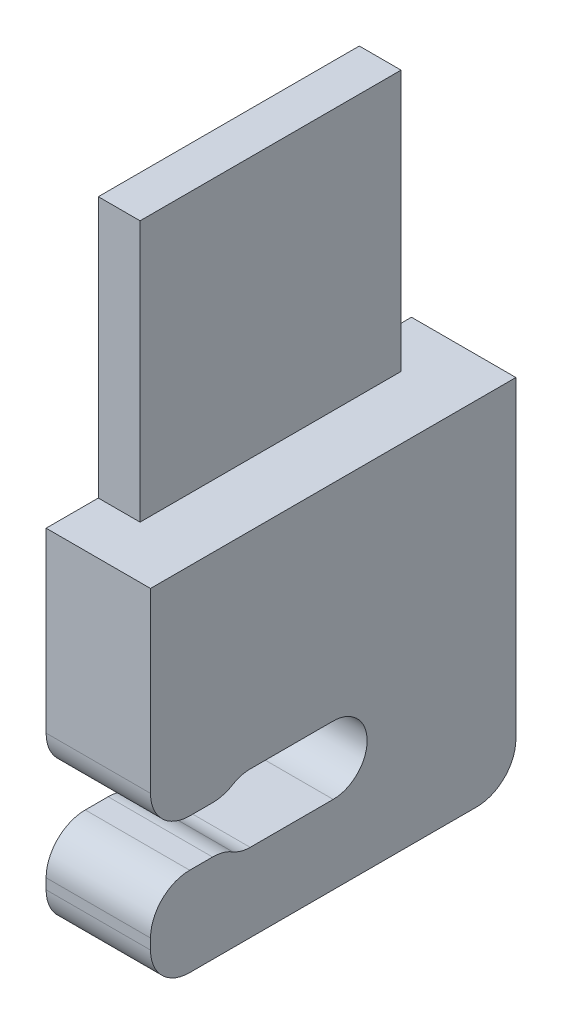
ISO-10303-21;
HEADER;
FILE_DESCRIPTION(('STEP AP214'),'2;1');
FILE_NAME('part.step','',(''),(''),'','','');
FILE_SCHEMA(('AUTOMOTIVE_DESIGN { 1 0 10303 214 1 1 1 1 }'));
ENDSEC;
DATA;
#1=APPLICATION_CONTEXT('core data for automotive mechanical design processes');
#2=APPLICATION_PROTOCOL_DEFINITION('international standard','automotive_design',2000,#1);
#3=PRODUCT_CONTEXT('',#1,'mechanical');
#4=PRODUCT('Part','Part','',(#3));
#5=PRODUCT_RELATED_PRODUCT_CATEGORY('part','',(#4));
#6=PRODUCT_DEFINITION_FORMATION('','',#4);
#7=PRODUCT_DEFINITION_CONTEXT('part definition',#1,'design');
#8=PRODUCT_DEFINITION('design','',#6,#7);
#9=PRODUCT_DEFINITION_SHAPE('','',#8);
#10=(LENGTH_UNIT() NAMED_UNIT(*) SI_UNIT(.MILLI.,.METRE.));
#11=(NAMED_UNIT(*) PLANE_ANGLE_UNIT() SI_UNIT($,.RADIAN.));
#12=(NAMED_UNIT(*) SI_UNIT($,.STERADIAN.) SOLID_ANGLE_UNIT());
#13=UNCERTAINTY_MEASURE_WITH_UNIT(LENGTH_MEASURE(1.E-05),#10,'distance_accuracy_value','');
#14=(GEOMETRIC_REPRESENTATION_CONTEXT(3) GLOBAL_UNCERTAINTY_ASSIGNED_CONTEXT((#13)) GLOBAL_UNIT_ASSIGNED_CONTEXT((#10,
#11,#12)) REPRESENTATION_CONTEXT('',''));
#15=CARTESIAN_POINT('',(0.,0.,0.));
#16=DIRECTION('',(0.,0.,1.));
#17=DIRECTION('',(1.,0.,0.));
#18=AXIS2_PLACEMENT_3D('',#15,#16,#17);
#19=CARTESIAN_POINT('',(1.6,0.,-10.));
#20=DIRECTION('',(0.,0.,1.));
#21=DIRECTION('',(0.,-1.,0.));
#22=AXIS2_PLACEMENT_3D('',#19,#20,#21);
#23=PLANE('',#22);
#24=DIRECTION('',(1.,0.,0.));
#25=VECTOR('',#24,1.);
#26=CARTESIAN_POINT('',(4.,-10.,-10.));
#27=LINE('',#26,#25);
#28=CARTESIAN_POINT('',(0.,-10.,-10.));
#29=VERTEX_POINT('',#28);
#30=CARTESIAN_POINT('',(1.6,-10.,-10.));
#31=VERTEX_POINT('',#30);
#32=EDGE_CURVE('E279',#29,#31,#27,.T.);
#33=ORIENTED_EDGE('',*,*,#32,.F.);
#34=DIRECTION('',(0.,1.,0.));
#35=VECTOR('',#34,1.);
#36=CARTESIAN_POINT('',(0.,0.,-10.));
#37=LINE('',#36,#35);
#38=CARTESIAN_POINT('',(0.,0.,-10.));
#39=VERTEX_POINT('',#38);
#40=EDGE_CURVE('E337',#29,#39,#37,.T.);
#41=ORIENTED_EDGE('',*,*,#40,.T.);
#42=DIRECTION('',(-1.,0.,0.));
#43=VECTOR('',#42,1.);
#44=CARTESIAN_POINT('',(1.6,0.,-10.));
#45=LINE('',#44,#43);
#46=CARTESIAN_POINT('',(1.6,0.,-10.));
#47=VERTEX_POINT('',#46);
#48=EDGE_CURVE('E310',#47,#39,#45,.T.);
#49=ORIENTED_EDGE('',*,*,#48,.F.);
#50=DIRECTION('',(0.,1.,0.));
#51=VECTOR('',#50,1.);
#52=CARTESIAN_POINT('',(1.6,0.,-10.));
#53=LINE('',#52,#51);
#54=EDGE_CURVE('E328',#31,#47,#53,.T.);
#55=ORIENTED_EDGE('',*,*,#54,.F.);
#56=EDGE_LOOP('',(#33,#41,#49,#55));
#57=FACE_BOUND('',#56,.T.);
#58=ADVANCED_FACE('F41',(#57),#23,.F.);
#59=CARTESIAN_POINT('',(1.6,0.,0.));
#60=DIRECTION('',(0.,0.,-1.));
#61=DIRECTION('',(-1.,0.,0.));
#62=AXIS2_PLACEMENT_3D('',#59,#60,#61);
#63=PLANE('',#62);
#64=DIRECTION('',(-1.,0.,0.));
#65=VECTOR('',#64,1.);
#66=CARTESIAN_POINT('',(4.,-10.,0.));
#67=LINE('',#66,#65);
#68=CARTESIAN_POINT('',(1.6,-10.,0.));
#69=VERTEX_POINT('',#68);
#70=CARTESIAN_POINT('',(0.,-10.,0.));
#71=VERTEX_POINT('',#70);
#72=EDGE_CURVE('E305',#69,#71,#67,.T.);
#73=ORIENTED_EDGE('',*,*,#72,.F.);
#74=DIRECTION('',(0.,-1.,0.));
#75=VECTOR('',#74,1.);
#76=CARTESIAN_POINT('',(1.6,0.,0.));
#77=LINE('',#76,#75);
#78=CARTESIAN_POINT('',(1.6,0.,0.));
#79=VERTEX_POINT('',#78);
#80=EDGE_CURVE('E319',#79,#69,#77,.T.);
#81=ORIENTED_EDGE('',*,*,#80,.F.);
#82=DIRECTION('',(-1.,0.,0.));
#83=VECTOR('',#82,1.);
#84=CARTESIAN_POINT('',(1.6,0.,0.));
#85=LINE('',#84,#83);
#86=CARTESIAN_POINT('',(0.,0.,0.));
#87=VERTEX_POINT('',#86);
#88=EDGE_CURVE('E334',#79,#87,#85,.T.);
#89=ORIENTED_EDGE('',*,*,#88,.T.);
#90=DIRECTION('',(0.,-1.,0.));
#91=VECTOR('',#90,1.);
#92=CARTESIAN_POINT('',(0.,0.,0.));
#93=LINE('',#92,#91);
#94=EDGE_CURVE('E318',#87,#71,#93,.T.);
#95=ORIENTED_EDGE('',*,*,#94,.T.);
#96=EDGE_LOOP('',(#73,#81,#89,#95));
#97=FACE_BOUND('',#96,.T.);
#98=ADVANCED_FACE('F425',(#97),#63,.F.);
#99=CARTESIAN_POINT('',(1.6,0.,0.));
#100=DIRECTION('',(0.,-1.,0.));
#101=DIRECTION('',(0.,0.,-1.));
#102=AXIS2_PLACEMENT_3D('',#99,#100,#101);
#103=PLANE('',#102);
#104=DIRECTION('',(0.,0.,1.));
#105=VECTOR('',#104,1.);
#106=CARTESIAN_POINT('',(0.,0.,0.));
#107=LINE('',#106,#105);
#108=EDGE_CURVE('E324',#39,#87,#107,.T.);
#109=ORIENTED_EDGE('',*,*,#108,.T.);
#110=ORIENTED_EDGE('',*,*,#88,.F.);
#111=DIRECTION('',(0.,0.,1.));
#112=VECTOR('',#111,1.);
#113=CARTESIAN_POINT('',(1.6,0.,0.));
#114=LINE('',#113,#112);
#115=EDGE_CURVE('E331',#47,#79,#114,.T.);
#116=ORIENTED_EDGE('',*,*,#115,.F.);
#117=ORIENTED_EDGE('',*,*,#48,.T.);
#118=EDGE_LOOP('',(#109,#110,#116,#117));
#119=FACE_BOUND('',#118,.T.);
#120=ADVANCED_FACE('F429',(#119),#103,.F.);
#121=CARTESIAN_POINT('',(1.6,0.,0.));
#122=DIRECTION('',(1.,0.,0.));
#123=DIRECTION('',(0.,0.,-1.));
#124=AXIS2_PLACEMENT_3D('',#121,#122,#123);
#125=PLANE('',#124);
#126=ORIENTED_EDGE('',*,*,#80,.T.);
#127=DIRECTION('',(0.,0.,-1.));
#128=VECTOR('',#127,1.);
#129=CARTESIAN_POINT('',(1.6,-10.,0.));
#130=LINE('',#129,#128);
#131=EDGE_CURVE('E323',#69,#31,#130,.T.);
#132=ORIENTED_EDGE('',*,*,#131,.T.);
#133=ORIENTED_EDGE('',*,*,#54,.T.);
#134=ORIENTED_EDGE('',*,*,#115,.T.);
#135=EDGE_LOOP('',(#126,#132,#133,#134));
#136=FACE_BOUND('',#135,.T.);
#137=ADVANCED_FACE('F438',(#136),#125,.T.);
#138=CARTESIAN_POINT('',(0.,0.,0.));
#139=DIRECTION('',(1.,0.,0.));
#140=DIRECTION('',(0.,0.,-1.));
#141=AXIS2_PLACEMENT_3D('',#138,#139,#140);
#142=PLANE('',#141);
#143=DIRECTION('',(0.,1.,0.));
#144=VECTOR('',#143,1.);
#145=CARTESIAN_POINT('',(0.,0.,2.));
#146=LINE('',#145,#144);
#147=CARTESIAN_POINT('',(0.,-22.,2.));
#148=VERTEX_POINT('',#147);
#149=CARTESIAN_POINT('',(0.,-21.6,2.));
#150=VERTEX_POINT('',#149);
#151=EDGE_CURVE('E717',#148,#150,#146,.T.);
#152=ORIENTED_EDGE('',*,*,#151,.T.);
#153=CARTESIAN_POINT('',(0.,-21.6,0.499999999999999));
#154=DIRECTION('',(1.,0.,0.));
#155=DIRECTION('',(0.,0.,-1.));
#156=AXIS2_PLACEMENT_3D('',#153,#154,#155);
#157=CIRCLE('',#156,1.5);
#158=CARTESIAN_POINT('',(0.,-20.1,0.499999999999999));
#159=VERTEX_POINT('',#158);
#160=EDGE_CURVE('E376',#150,#159,#157,.F.);
#161=ORIENTED_EDGE('',*,*,#160,.T.);
#162=DIRECTION('',(0.,0.,-1.));
#163=VECTOR('',#162,1.);
#164=CARTESIAN_POINT('',(0.,-20.1,0.));
#165=LINE('',#164,#163);
#166=CARTESIAN_POINT('',(0.,-20.1,-0.376528683431878));
#167=VERTEX_POINT('',#166);
#168=EDGE_CURVE('E729',#159,#167,#165,.T.);
#169=ORIENTED_EDGE('',*,*,#168,.T.);
#170=CARTESIAN_POINT('',(0.,-21.6,-0.376528683431878));
#171=DIRECTION('',(1.,0.,0.));
#172=DIRECTION('',(0.,0.,-1.));
#173=AXIS2_PLACEMENT_3D('',#170,#171,#172);
#174=CIRCLE('',#173,1.5);
#175=CARTESIAN_POINT('',(0.,-20.3142857142857,-1.14914681388844));
#176=VERTEX_POINT('',#175);
#177=EDGE_CURVE('E373',#167,#176,#174,.F.);
#178=ORIENTED_EDGE('',*,*,#177,.T.);
#179=CARTESIAN_POINT('',(0.,-19.2,-1.81874919361747));
#180=DIRECTION('',(1.,0.,0.));
#181=DIRECTION('',(0.,0.,-1.));
#182=AXIS2_PLACEMENT_3D('',#179,#180,#181);
#183=CIRCLE('',#182,1.3);
#184=CARTESIAN_POINT('',(0.,-20.5,-1.81874919361747));
#185=VERTEX_POINT('',#184);
#186=EDGE_CURVE('E256',#185,#176,#183,.F.);
#187=ORIENTED_EDGE('',*,*,#186,.F.);
#188=DIRECTION('',(0.,0.,-1.));
#189=VECTOR('',#188,1.);
#190=CARTESIAN_POINT('',(0.,-20.5,0.));
#191=LINE('',#190,#189);
#192=CARTESIAN_POINT('',(0.,-20.5,-5.));
#193=VERTEX_POINT('',#192);
#194=EDGE_CURVE('E276',#185,#193,#191,.T.);
#195=ORIENTED_EDGE('',*,*,#194,.T.);
#196=CARTESIAN_POINT('',(0.,-19.2,-5.));
#197=DIRECTION('',(1.,0.,0.));
#198=DIRECTION('',(0.,0.,-1.));
#199=AXIS2_PLACEMENT_3D('',#196,#197,#198);
#200=CIRCLE('',#199,1.3);
#201=CARTESIAN_POINT('',(0.,-17.9,-5.));
#202=VERTEX_POINT('',#201);
#203=EDGE_CURVE('E199',#202,#193,#200,.F.);
#204=ORIENTED_EDGE('',*,*,#203,.F.);
#205=DIRECTION('',(0.,0.,-1.));
#206=VECTOR('',#205,1.);
#207=CARTESIAN_POINT('',(0.,-17.9,0.));
#208=LINE('',#207,#206);
#209=CARTESIAN_POINT('',(0.,-17.9,-1.81874919361747));
#210=VERTEX_POINT('',#209);
#211=EDGE_CURVE('E400',#210,#202,#208,.T.);
#212=ORIENTED_EDGE('',*,*,#211,.F.);
#213=CARTESIAN_POINT('',(0.,-19.2,-1.81874919361747));
#214=DIRECTION('',(1.,0.,0.));
#215=DIRECTION('',(0.,0.,-1.));
#216=AXIS2_PLACEMENT_3D('',#213,#214,#215);
#217=CIRCLE('',#216,1.3);
#218=CARTESIAN_POINT('',(0.,-18.0857142857143,-1.14914681388844));
#219=VERTEX_POINT('',#218);
#220=EDGE_CURVE('E394',#219,#210,#217,.F.);
#221=ORIENTED_EDGE('',*,*,#220,.F.);
#222=CARTESIAN_POINT('',(0.,-16.8,-0.376528683431878));
#223=DIRECTION('',(1.,0.,0.));
#224=DIRECTION('',(0.,0.,-1.));
#225=AXIS2_PLACEMENT_3D('',#222,#223,#224);
#226=CIRCLE('',#225,1.5);
#227=CARTESIAN_POINT('',(0.,-18.3,-0.376528683431878));
#228=VERTEX_POINT('',#227);
#229=EDGE_CURVE('E63',#219,#228,#226,.F.);
#230=ORIENTED_EDGE('',*,*,#229,.T.);
#231=DIRECTION('',(0.,0.,-1.));
#232=VECTOR('',#231,1.);
#233=CARTESIAN_POINT('',(0.,-18.3,0.));
#234=LINE('',#233,#232);
#235=CARTESIAN_POINT('',(0.,-18.3,0.5));
#236=VERTEX_POINT('',#235);
#237=EDGE_CURVE('E403',#236,#228,#234,.T.);
#238=ORIENTED_EDGE('',*,*,#237,.F.);
#239=CARTESIAN_POINT('',(0.,-16.8,0.5));
#240=DIRECTION('',(1.,0.,0.));
#241=DIRECTION('',(0.,0.,-1.));
#242=AXIS2_PLACEMENT_3D('',#239,#240,#241);
#243=CIRCLE('',#242,1.5);
#244=CARTESIAN_POINT('',(0.,-16.8,2.));
#245=VERTEX_POINT('',#244);
#246=EDGE_CURVE('E57',#236,#245,#243,.F.);
#247=ORIENTED_EDGE('',*,*,#246,.T.);
#248=DIRECTION('',(0.,-1.,0.));
#249=VECTOR('',#248,1.);
#250=CARTESIAN_POINT('',(0.,-10.,2.));
#251=LINE('',#250,#249);
#252=CARTESIAN_POINT('',(0.,-10.,2.));
#253=VERTEX_POINT('',#252);
#254=EDGE_CURVE('E301',#253,#245,#251,.T.);
#255=ORIENTED_EDGE('',*,*,#254,.F.);
#256=DIRECTION('',(0.,0.,-1.));
#257=VECTOR('',#256,1.);
#258=CARTESIAN_POINT('',(0.,-10.,2.));
#259=LINE('',#258,#257);
#260=EDGE_CURVE('E304',#253,#71,#259,.T.);
#261=ORIENTED_EDGE('',*,*,#260,.T.);
#262=ORIENTED_EDGE('',*,*,#94,.F.);
#263=ORIENTED_EDGE('',*,*,#108,.F.);
#264=ORIENTED_EDGE('',*,*,#40,.F.);
#265=DIRECTION('',(0.,0.,1.));
#266=VECTOR('',#265,1.);
#267=CARTESIAN_POINT('',(0.,-10.,-12.));
#268=LINE('',#267,#266);
#269=CARTESIAN_POINT('',(0.,-10.,-12.));
#270=VERTEX_POINT('',#269);
#271=EDGE_CURVE('E290',#270,#29,#268,.T.);
#272=ORIENTED_EDGE('',*,*,#271,.F.);
#273=DIRECTION('',(0.,1.,0.));
#274=VECTOR('',#273,1.);
#275=CARTESIAN_POINT('',(0.,-10.,-12.));
#276=LINE('',#275,#274);
#277=CARTESIAN_POINT('',(0.,-22.,-12.));
#278=VERTEX_POINT('',#277);
#279=EDGE_CURVE('E283',#278,#270,#276,.T.);
#280=ORIENTED_EDGE('',*,*,#279,.F.);
#281=CARTESIAN_POINT('',(0.,-22.,-10.5));
#282=DIRECTION('',(1.,0.,0.));
#283=DIRECTION('',(0.,0.,-1.));
#284=AXIS2_PLACEMENT_3D('',#281,#282,#283);
#285=CIRCLE('',#284,1.5);
#286=CARTESIAN_POINT('',(0.,-23.5,-10.5));
#287=VERTEX_POINT('',#286);
#288=EDGE_CURVE('E704',#278,#287,#285,.F.);
#289=ORIENTED_EDGE('',*,*,#288,.T.);
#290=DIRECTION('',(0.,0.,1.));
#291=VECTOR('',#290,1.);
#292=CARTESIAN_POINT('',(0.,-23.5,0.));
#293=LINE('',#292,#291);
#294=CARTESIAN_POINT('',(0.,-23.5,0.499999999999999));
#295=VERTEX_POINT('',#294);
#296=EDGE_CURVE('E709',#287,#295,#293,.T.);
#297=ORIENTED_EDGE('',*,*,#296,.T.);
#298=CARTESIAN_POINT('',(0.,-22.,0.499999999999999));
#299=DIRECTION('',(1.,0.,0.));
#300=DIRECTION('',(0.,0.,-1.));
#301=AXIS2_PLACEMENT_3D('',#298,#299,#300);
#302=CIRCLE('',#301,1.5);
#303=EDGE_CURVE('E712',#295,#148,#302,.F.);
#304=ORIENTED_EDGE('',*,*,#303,.T.);
#305=EDGE_LOOP('',(#152,#161,#169,#178,#187,#195,#204,#212,#221,#230,#238,#247,#255,#261,#262,
#263,#264,#272,#280,#289,#297,#304));
#306=FACE_BOUND('',#305,.T.);
#307=ADVANCED_FACE('F398',(#306),#142,.F.);
#308=CARTESIAN_POINT('',(4.,0.,-14.4721359549996));
#309=DIRECTION('',(-1.,0.,0.));
#310=DIRECTION('',(0.,-1.,0.));
#311=AXIS2_PLACEMENT_3D('',#308,#309,#310);
#312=PLANE('',#311);
#313=DIRECTION('',(0.,0.,1.));
#314=VECTOR('',#313,1.);
#315=CARTESIAN_POINT('',(4.,-20.1,0.));
#316=LINE('',#315,#314);
#317=CARTESIAN_POINT('',(4.,-20.1,-0.376528683431878));
#318=VERTEX_POINT('',#317);
#319=CARTESIAN_POINT('',(4.,-20.1,0.499999999999999));
#320=VERTEX_POINT('',#319);
#321=EDGE_CURVE('E225',#318,#320,#316,.T.);
#322=ORIENTED_EDGE('',*,*,#321,.T.);
#323=CARTESIAN_POINT('',(3.99999999999999,-21.6,0.499999999999999));
#324=DIRECTION('',(-1.,0.,0.));
#325=DIRECTION('',(0.,-1.,0.));
#326=AXIS2_PLACEMENT_3D('',#323,#324,#325);
#327=CIRCLE('',#326,1.5);
#328=CARTESIAN_POINT('',(4.,-21.6,2.));
#329=VERTEX_POINT('',#328);
#330=EDGE_CURVE('E363',#320,#329,#327,.F.);
#331=ORIENTED_EDGE('',*,*,#330,.T.);
#332=DIRECTION('',(0.,-1.,0.));
#333=VECTOR('',#332,1.);
#334=CARTESIAN_POINT('',(4.00000000000001,0.,2.));
#335=LINE('',#334,#333);
#336=CARTESIAN_POINT('',(3.99999999999999,-22.,2.));
#337=VERTEX_POINT('',#336);
#338=EDGE_CURVE('E232',#329,#337,#335,.T.);
#339=ORIENTED_EDGE('',*,*,#338,.T.);
#340=CARTESIAN_POINT('',(3.99999999999999,-22.,0.499999999999999));
#341=DIRECTION('',(1.,0.,0.));
#342=DIRECTION('',(0.,1.,0.));
#343=AXIS2_PLACEMENT_3D('',#340,#341,#342);
#344=CIRCLE('',#343,1.5);
#345=CARTESIAN_POINT('',(3.99999999999999,-23.5,0.499999999999999));
#346=VERTEX_POINT('',#345);
#347=EDGE_CURVE('E235',#337,#346,#344,.T.);
#348=ORIENTED_EDGE('',*,*,#347,.T.);
#349=DIRECTION('',(0.,0.,-1.));
#350=VECTOR('',#349,1.);
#351=CARTESIAN_POINT('',(3.99999999999999,-23.5,0.));
#352=LINE('',#351,#350);
#353=CARTESIAN_POINT('',(3.99999999999999,-23.5,-10.5));
#354=VERTEX_POINT('',#353);
#355=EDGE_CURVE('E239',#346,#354,#352,.T.);
#356=ORIENTED_EDGE('',*,*,#355,.T.);
#357=CARTESIAN_POINT('',(3.99999999999999,-22.,-10.5));
#358=DIRECTION('',(1.,0.,0.));
#359=DIRECTION('',(0.,1.,0.));
#360=AXIS2_PLACEMENT_3D('',#357,#358,#359);
#361=CIRCLE('',#360,1.5);
#362=CARTESIAN_POINT('',(3.99999999999999,-22.,-12.));
#363=VERTEX_POINT('',#362);
#364=EDGE_CURVE('E243',#354,#363,#361,.T.);
#365=ORIENTED_EDGE('',*,*,#364,.T.);
#366=DIRECTION('',(0.,-1.,0.));
#367=VECTOR('',#366,1.);
#368=CARTESIAN_POINT('',(4.,-10.,-12.));
#369=LINE('',#368,#367);
#370=CARTESIAN_POINT('',(4.,-10.,-12.));
#371=VERTEX_POINT('',#370);
#372=EDGE_CURVE('E280',#371,#363,#369,.T.);
#373=ORIENTED_EDGE('',*,*,#372,.F.);
#374=DIRECTION('',(0.,0.,1.));
#375=VECTOR('',#374,1.);
#376=CARTESIAN_POINT('',(4.,-10.,-14.4721359549996));
#377=LINE('',#376,#375);
#378=CARTESIAN_POINT('',(4.,-10.,2.));
#379=VERTEX_POINT('',#378);
#380=EDGE_CURVE('E314',#371,#379,#377,.T.);
#381=ORIENTED_EDGE('',*,*,#380,.T.);
#382=DIRECTION('',(0.,1.,0.));
#383=VECTOR('',#382,1.);
#384=CARTESIAN_POINT('',(4.,-10.,2.));
#385=LINE('',#384,#383);
#386=CARTESIAN_POINT('',(4.,-16.8,2.));
#387=VERTEX_POINT('',#386);
#388=EDGE_CURVE('E295',#387,#379,#385,.T.);
#389=ORIENTED_EDGE('',*,*,#388,.F.);
#390=CARTESIAN_POINT('',(4.,-16.8,0.5));
#391=DIRECTION('',(-1.,0.,0.));
#392=DIRECTION('',(0.,-1.,0.));
#393=AXIS2_PLACEMENT_3D('',#390,#391,#392);
#394=CIRCLE('',#393,1.5);
#395=CARTESIAN_POINT('',(4.,-18.3,0.5));
#396=VERTEX_POINT('',#395);
#397=EDGE_CURVE('E354',#387,#396,#394,.F.);
#398=ORIENTED_EDGE('',*,*,#397,.T.);
#399=DIRECTION('',(0.,0.,1.));
#400=VECTOR('',#399,1.);
#401=CARTESIAN_POINT('',(4.,-18.3,0.));
#402=LINE('',#401,#400);
#403=CARTESIAN_POINT('',(4.,-18.3,-0.376528683431878));
#404=VERTEX_POINT('',#403);
#405=EDGE_CURVE('E247',#404,#396,#402,.T.);
#406=ORIENTED_EDGE('',*,*,#405,.F.);
#407=CARTESIAN_POINT('',(4.,-16.8,-0.376528683431878));
#408=DIRECTION('',(-1.,0.,0.));
#409=DIRECTION('',(0.,-1.,0.));
#410=AXIS2_PLACEMENT_3D('',#407,#408,#409);
#411=CIRCLE('',#410,1.5);
#412=CARTESIAN_POINT('',(4.,-18.0857142857143,-1.14914681388844));
#413=VERTEX_POINT('',#412);
#414=EDGE_CURVE('E357',#404,#413,#411,.F.);
#415=ORIENTED_EDGE('',*,*,#414,.T.);
#416=CARTESIAN_POINT('',(4.,-19.2,-1.81874919361747));
#417=DIRECTION('',(1.,0.,0.));
#418=DIRECTION('',(0.,1.,0.));
#419=AXIS2_PLACEMENT_3D('',#416,#417,#418);
#420=CIRCLE('',#419,1.3);
#421=CARTESIAN_POINT('',(4.,-17.9,-1.81874919361747));
#422=VERTEX_POINT('',#421);
#423=EDGE_CURVE('E227',#422,#413,#420,.T.);
#424=ORIENTED_EDGE('',*,*,#423,.F.);
#425=DIRECTION('',(0.,0.,1.));
#426=VECTOR('',#425,1.);
#427=CARTESIAN_POINT('',(4.,-17.9,0.));
#428=LINE('',#427,#426);
#429=CARTESIAN_POINT('',(4.,-17.9,-5.));
#430=VERTEX_POINT('',#429);
#431=EDGE_CURVE('E205',#430,#422,#428,.T.);
#432=ORIENTED_EDGE('',*,*,#431,.F.);
#433=CARTESIAN_POINT('',(4.,-19.2,-5.));
#434=DIRECTION('',(1.,0.,0.));
#435=DIRECTION('',(0.,1.,0.));
#436=AXIS2_PLACEMENT_3D('',#433,#434,#435);
#437=CIRCLE('',#436,1.3);
#438=CARTESIAN_POINT('',(4.,-20.5,-5.));
#439=VERTEX_POINT('',#438);
#440=EDGE_CURVE('E198',#439,#430,#437,.T.);
#441=ORIENTED_EDGE('',*,*,#440,.F.);
#442=DIRECTION('',(0.,0.,1.));
#443=VECTOR('',#442,1.);
#444=CARTESIAN_POINT('',(4.,-20.5,0.));
#445=LINE('',#444,#443);
#446=CARTESIAN_POINT('',(4.,-20.5,-1.81874919361747));
#447=VERTEX_POINT('',#446);
#448=EDGE_CURVE('E213',#439,#447,#445,.T.);
#449=ORIENTED_EDGE('',*,*,#448,.T.);
#450=CARTESIAN_POINT('',(4.,-20.3142857142857,-1.14914681388844));
#451=VERTEX_POINT('',#450);
#452=EDGE_CURVE('E222',#451,#447,#420,.T.);
#453=ORIENTED_EDGE('',*,*,#452,.F.);
#454=CARTESIAN_POINT('',(3.99999999999999,-21.6,-0.376528683431878));
#455=DIRECTION('',(-1.,0.,0.));
#456=DIRECTION('',(0.,-1.,0.));
#457=AXIS2_PLACEMENT_3D('',#454,#455,#456);
#458=CIRCLE('',#457,1.5);
#459=EDGE_CURVE('E360',#451,#318,#458,.F.);
#460=ORIENTED_EDGE('',*,*,#459,.T.);
#461=EDGE_LOOP('',(#322,#331,#339,#348,#356,#365,#373,#381,#389,#398,#406,#415,#424,#432,#441,
#449,#453,#460));
#462=FACE_BOUND('',#461,.T.);
#463=ADVANCED_FACE('F211',(#462),#312,.F.);
#464=CARTESIAN_POINT('',(0.,-10.,-14.4721359549996));
#465=DIRECTION('',(0.,-1.,0.));
#466=DIRECTION('',(0.,0.,-1.));
#467=AXIS2_PLACEMENT_3D('',#464,#465,#466);
#468=PLANE('',#467);
#469=ORIENTED_EDGE('',*,*,#131,.F.);
#470=ORIENTED_EDGE('',*,*,#72,.T.);
#471=ORIENTED_EDGE('',*,*,#260,.F.);
#472=DIRECTION('',(-1.,0.,0.));
#473=VECTOR('',#472,1.);
#474=CARTESIAN_POINT('',(4.,-10.,2.));
#475=LINE('',#474,#473);
#476=EDGE_CURVE('E298',#379,#253,#475,.T.);
#477=ORIENTED_EDGE('',*,*,#476,.F.);
#478=ORIENTED_EDGE('',*,*,#380,.F.);
#479=DIRECTION('',(1.,0.,0.));
#480=VECTOR('',#479,1.);
#481=CARTESIAN_POINT('',(4.,-10.,-12.));
#482=LINE('',#481,#480);
#483=EDGE_CURVE('E286',#270,#371,#482,.T.);
#484=ORIENTED_EDGE('',*,*,#483,.F.);
#485=ORIENTED_EDGE('',*,*,#271,.T.);
#486=ORIENTED_EDGE('',*,*,#32,.T.);
#487=EDGE_LOOP('',(#469,#470,#471,#477,#478,#484,#485,#486));
#488=FACE_BOUND('',#487,.T.);
#489=ADVANCED_FACE('F422',(#488),#468,.F.);
#490=CARTESIAN_POINT('',(0.,0.,2.));
#491=DIRECTION('',(0.,0.,-1.));
#492=DIRECTION('',(-1.,0.,0.));
#493=AXIS2_PLACEMENT_3D('',#490,#491,#492);
#494=PLANE('',#493);
#495=ORIENTED_EDGE('',*,*,#254,.T.);
#496=DIRECTION('',(1.,0.,0.));
#497=VECTOR('',#496,1.);
#498=CARTESIAN_POINT('',(0.,-16.8,2.));
#499=LINE('',#498,#497);
#500=EDGE_CURVE('E11',#245,#387,#499,.T.);
#501=ORIENTED_EDGE('',*,*,#500,.T.);
#502=ORIENTED_EDGE('',*,*,#388,.T.);
#503=ORIENTED_EDGE('',*,*,#476,.T.);
#504=EDGE_LOOP('',(#495,#501,#502,#503));
#505=FACE_BOUND('',#504,.T.);
#506=ADVANCED_FACE('F415',(#505),#494,.F.);
#507=CARTESIAN_POINT('',(0.,0.,-12.));
#508=DIRECTION('',(0.,0.,-1.));
#509=DIRECTION('',(-1.,0.,0.));
#510=AXIS2_PLACEMENT_3D('',#507,#508,#509);
#511=PLANE('',#510);
#512=ORIENTED_EDGE('',*,*,#372,.T.);
#513=DIRECTION('',(1.,0.,0.));
#514=VECTOR('',#513,1.);
#515=CARTESIAN_POINT('',(-18.1176709319934,-22.,-12.));
#516=LINE('',#515,#514);
#517=EDGE_CURVE('E260',#278,#363,#516,.T.);
#518=ORIENTED_EDGE('',*,*,#517,.F.);
#519=ORIENTED_EDGE('',*,*,#279,.T.);
#520=ORIENTED_EDGE('',*,*,#483,.T.);
#521=EDGE_LOOP('',(#512,#518,#519,#520));
#522=FACE_BOUND('',#521,.T.);
#523=ADVANCED_FACE('F549',(#522),#511,.T.);
#524=CARTESIAN_POINT('',(-18.1176709319934,-19.2,-5.));
#525=DIRECTION('',(1.,0.,0.));
#526=DIRECTION('',(0.,1.,0.));
#527=AXIS2_PLACEMENT_3D('',#524,#525,#526);
#528=CYLINDRICAL_SURFACE('',#527,1.3);
#529=DIRECTION('',(1.,0.,0.));
#530=VECTOR('',#529,1.);
#531=CARTESIAN_POINT('',(-18.1176709319934,-17.9,-5.));
#532=LINE('',#531,#530);
#533=EDGE_CURVE('E253',#202,#430,#532,.T.);
#534=ORIENTED_EDGE('',*,*,#533,.F.);
#535=ORIENTED_EDGE('',*,*,#203,.T.);
#536=DIRECTION('',(1.,0.,0.));
#537=VECTOR('',#536,1.);
#538=CARTESIAN_POINT('',(-18.1176709319934,-20.5,-5.));
#539=LINE('',#538,#537);
#540=EDGE_CURVE('E194',#193,#439,#539,.T.);
#541=ORIENTED_EDGE('',*,*,#540,.T.);
#542=ORIENTED_EDGE('',*,*,#440,.T.);
#543=EDGE_LOOP('',(#534,#535,#541,#542));
#544=FACE_BOUND('',#543,.T.);
#545=ADVANCED_FACE('F197',(#544),#528,.F.);
#546=CARTESIAN_POINT('',(-18.1176709319934,-17.9,0.));
#547=DIRECTION('',(0.,1.,0.));
#548=DIRECTION('',(0.,0.,1.));
#549=AXIS2_PLACEMENT_3D('',#546,#547,#548);
#550=PLANE('',#549);
#551=DIRECTION('',(1.,0.,0.));
#552=VECTOR('',#551,1.);
#553=CARTESIAN_POINT('',(-18.1176709319934,-17.9,-1.81874919361747));
#554=LINE('',#553,#552);
#555=EDGE_CURVE('E257',#210,#422,#554,.T.);
#556=ORIENTED_EDGE('',*,*,#555,.F.);
#557=ORIENTED_EDGE('',*,*,#211,.T.);
#558=ORIENTED_EDGE('',*,*,#533,.T.);
#559=ORIENTED_EDGE('',*,*,#431,.T.);
#560=EDGE_LOOP('',(#556,#557,#558,#559));
#561=FACE_BOUND('',#560,.T.);
#562=ADVANCED_FACE('F539',(#561),#550,.F.);
#563=CARTESIAN_POINT('',(-18.1176709319934,-19.2,-1.81874919361747));
#564=DIRECTION('',(1.,0.,0.));
#565=DIRECTION('',(0.,1.,0.));
#566=AXIS2_PLACEMENT_3D('',#563,#564,#565);
#567=CYLINDRICAL_SURFACE('',#566,1.3);
#568=ORIENTED_EDGE('',*,*,#423,.T.);
#569=DIRECTION('',(1.,0.,0.));
#570=VECTOR('',#569,1.);
#571=CARTESIAN_POINT('',(-18.1176709319934,-18.0857142857143,-1.14914681388844));
#572=LINE('',#571,#570);
#573=EDGE_CURVE('E50',#413,#219,#572,.F.);
#574=ORIENTED_EDGE('',*,*,#573,.T.);
#575=ORIENTED_EDGE('',*,*,#220,.T.);
#576=ORIENTED_EDGE('',*,*,#555,.T.);
#577=EDGE_LOOP('',(#568,#574,#575,#576));
#578=FACE_BOUND('',#577,.T.);
#579=ADVANCED_FACE('F393',(#578),#567,.F.);
#580=CARTESIAN_POINT('',(-18.1176709319934,-18.3,0.));
#581=DIRECTION('',(0.,1.,0.));
#582=DIRECTION('',(-1.,0.,0.));
#583=AXIS2_PLACEMENT_3D('',#580,#581,#582);
#584=PLANE('',#583);
#585=ORIENTED_EDGE('',*,*,#237,.T.);
#586=DIRECTION('',(1.,0.,0.));
#587=VECTOR('',#586,1.);
#588=CARTESIAN_POINT('',(-18.1176709319934,-18.3,-0.376528683431878));
#589=LINE('',#588,#587);
#590=EDGE_CURVE('E386',#228,#404,#589,.T.);
#591=ORIENTED_EDGE('',*,*,#590,.T.);
#592=ORIENTED_EDGE('',*,*,#405,.T.);
#593=DIRECTION('',(1.,0.,0.));
#594=VECTOR('',#593,1.);
#595=CARTESIAN_POINT('',(-18.1176709319934,-18.3,0.5));
#596=LINE('',#595,#594);
#597=EDGE_CURVE('E383',#396,#236,#596,.F.);
#598=ORIENTED_EDGE('',*,*,#597,.T.);
#599=EDGE_LOOP('',(#585,#591,#592,#598));
#600=FACE_BOUND('',#599,.T.);
#601=ADVANCED_FACE('F409',(#600),#584,.F.);
#602=CARTESIAN_POINT('',(-18.1176709319934,-22.,-10.5));
#603=DIRECTION('',(1.,0.,0.));
#604=DIRECTION('',(0.,1.,0.));
#605=AXIS2_PLACEMENT_3D('',#602,#603,#604);
#606=CYLINDRICAL_SURFACE('',#605,1.5);
#607=ORIENTED_EDGE('',*,*,#288,.F.);
#608=ORIENTED_EDGE('',*,*,#517,.T.);
#609=ORIENTED_EDGE('',*,*,#364,.F.);
#610=DIRECTION('',(1.,0.,0.));
#611=VECTOR('',#610,1.);
#612=CARTESIAN_POINT('',(-18.1176709319934,-23.5,-10.5));
#613=LINE('',#612,#611);
#614=EDGE_CURVE('E264',#287,#354,#613,.T.);
#615=ORIENTED_EDGE('',*,*,#614,.F.);
#616=EDGE_LOOP('',(#607,#608,#609,#615));
#617=FACE_BOUND('',#616,.T.);
#618=ADVANCED_FACE('F528',(#617),#606,.T.);
#619=CARTESIAN_POINT('',(-18.1176709319934,-23.5,0.));
#620=DIRECTION('',(0.,-1.,0.));
#621=DIRECTION('',(1.,0.,0.));
#622=AXIS2_PLACEMENT_3D('',#619,#620,#621);
#623=PLANE('',#622);
#624=ORIENTED_EDGE('',*,*,#296,.F.);
#625=ORIENTED_EDGE('',*,*,#614,.T.);
#626=ORIENTED_EDGE('',*,*,#355,.F.);
#627=DIRECTION('',(1.,0.,0.));
#628=VECTOR('',#627,1.);
#629=CARTESIAN_POINT('',(-18.1176709319934,-23.5,0.499999999999999));
#630=LINE('',#629,#628);
#631=EDGE_CURVE('E267',#295,#346,#630,.T.);
#632=ORIENTED_EDGE('',*,*,#631,.F.);
#633=EDGE_LOOP('',(#624,#625,#626,#632));
#634=FACE_BOUND('',#633,.T.);
#635=ADVANCED_FACE('F583',(#634),#623,.T.);
#636=CARTESIAN_POINT('',(-18.1176709319934,-22.,0.499999999999999));
#637=DIRECTION('',(1.,0.,0.));
#638=DIRECTION('',(0.,1.,0.));
#639=AXIS2_PLACEMENT_3D('',#636,#637,#638);
#640=CYLINDRICAL_SURFACE('',#639,1.5);
#641=ORIENTED_EDGE('',*,*,#303,.F.);
#642=ORIENTED_EDGE('',*,*,#631,.T.);
#643=ORIENTED_EDGE('',*,*,#347,.F.);
#644=DIRECTION('',(1.,0.,0.));
#645=VECTOR('',#644,1.);
#646=CARTESIAN_POINT('',(-18.1176709319934,-22.,2.));
#647=LINE('',#646,#645);
#648=EDGE_CURVE('E270',#148,#337,#647,.T.);
#649=ORIENTED_EDGE('',*,*,#648,.F.);
#650=EDGE_LOOP('',(#641,#642,#643,#649));
#651=FACE_BOUND('',#650,.T.);
#652=ADVANCED_FACE('F516',(#651),#640,.T.);
#653=CARTESIAN_POINT('',(-18.1176709319934,0.,2.));
#654=DIRECTION('',(0.,0.,1.));
#655=DIRECTION('',(0.,-1.,0.));
#656=AXIS2_PLACEMENT_3D('',#653,#654,#655);
#657=PLANE('',#656);
#658=ORIENTED_EDGE('',*,*,#338,.F.);
#659=DIRECTION('',(1.,0.,0.));
#660=VECTOR('',#659,1.);
#661=CARTESIAN_POINT('',(-18.1176709319934,-21.6,2.));
#662=LINE('',#661,#660);
#663=EDGE_CURVE('E366',#329,#150,#662,.F.);
#664=ORIENTED_EDGE('',*,*,#663,.T.);
#665=ORIENTED_EDGE('',*,*,#151,.F.);
#666=ORIENTED_EDGE('',*,*,#648,.T.);
#667=EDGE_LOOP('',(#658,#664,#665,#666));
#668=FACE_BOUND('',#667,.T.);
#669=ADVANCED_FACE('F506',(#668),#657,.T.);
#670=CARTESIAN_POINT('',(-18.1176709319934,-20.1,0.));
#671=DIRECTION('',(0.,1.,0.));
#672=DIRECTION('',(-1.,0.,0.));
#673=AXIS2_PLACEMENT_3D('',#670,#671,#672);
#674=PLANE('',#673);
#675=ORIENTED_EDGE('',*,*,#168,.F.);
#676=DIRECTION('',(1.,0.,0.));
#677=VECTOR('',#676,1.);
#678=CARTESIAN_POINT('',(-18.1176709319934,-20.1,0.499999999999999));
#679=LINE('',#678,#677);
#680=EDGE_CURVE('E350',#159,#320,#679,.T.);
#681=ORIENTED_EDGE('',*,*,#680,.T.);
#682=ORIENTED_EDGE('',*,*,#321,.F.);
#683=DIRECTION('',(-1.,0.,0.));
#684=VECTOR('',#683,1.);
#685=CARTESIAN_POINT('',(0.,-20.1,-0.376528683431878));
#686=LINE('',#685,#684);
#687=EDGE_CURVE('E309',#318,#167,#686,.T.);
#688=ORIENTED_EDGE('',*,*,#687,.T.);
#689=EDGE_LOOP('',(#675,#681,#682,#688));
#690=FACE_BOUND('',#689,.T.);
#691=ADVANCED_FACE('F496',(#690),#674,.T.);
#692=ORIENTED_EDGE('',*,*,#186,.T.);
#693=DIRECTION('',(1.,0.,0.));
#694=VECTOR('',#693,1.);
#695=CARTESIAN_POINT('',(-18.1176709319934,-20.3142857142857,-1.14914681388844));
#696=LINE('',#695,#694);
#697=EDGE_CURVE('E379',#176,#451,#696,.T.);
#698=ORIENTED_EDGE('',*,*,#697,.T.);
#699=ORIENTED_EDGE('',*,*,#452,.T.);
#700=DIRECTION('',(1.,0.,0.));
#701=VECTOR('',#700,1.);
#702=CARTESIAN_POINT('',(-18.1176709319934,-20.5,-1.81874919361747));
#703=LINE('',#702,#701);
#704=EDGE_CURVE('E204',#185,#447,#703,.T.);
#705=ORIENTED_EDGE('',*,*,#704,.F.);
#706=EDGE_LOOP('',(#692,#698,#699,#705));
#707=FACE_BOUND('',#706,.T.);
#708=ADVANCED_FACE('F491',(#707),#567,.F.);
#709=CARTESIAN_POINT('',(-18.1176709319934,-20.5,0.));
#710=DIRECTION('',(0.,1.,0.));
#711=DIRECTION('',(-1.,0.,0.));
#712=AXIS2_PLACEMENT_3D('',#709,#710,#711);
#713=PLANE('',#712);
#714=ORIENTED_EDGE('',*,*,#194,.F.);
#715=ORIENTED_EDGE('',*,*,#704,.T.);
#716=ORIENTED_EDGE('',*,*,#448,.F.);
#717=ORIENTED_EDGE('',*,*,#540,.F.);
#718=EDGE_LOOP('',(#714,#715,#716,#717));
#719=FACE_BOUND('',#718,.T.);
#720=ADVANCED_FACE('F219',(#719),#713,.T.);
#721=CARTESIAN_POINT('',(-18.1176709319934,-21.6,0.499999999999999));
#722=DIRECTION('',(1.,0.,0.));
#723=DIRECTION('',(0.,1.,0.));
#724=AXIS2_PLACEMENT_3D('',#721,#722,#723);
#725=CYLINDRICAL_SURFACE('',#724,1.5);
#726=ORIENTED_EDGE('',*,*,#160,.F.);
#727=ORIENTED_EDGE('',*,*,#663,.F.);
#728=ORIENTED_EDGE('',*,*,#330,.F.);
#729=ORIENTED_EDGE('',*,*,#680,.F.);
#730=EDGE_LOOP('',(#726,#727,#728,#729));
#731=FACE_BOUND('',#730,.T.);
#732=ADVANCED_FACE('F455',(#731),#725,.T.);
#733=CARTESIAN_POINT('',(-18.1176709319934,-21.6,-0.376528683431878));
#734=DIRECTION('',(1.,0.,0.));
#735=DIRECTION('',(0.,1.,0.));
#736=AXIS2_PLACEMENT_3D('',#733,#734,#735);
#737=CYLINDRICAL_SURFACE('',#736,1.5);
#738=ORIENTED_EDGE('',*,*,#177,.F.);
#739=ORIENTED_EDGE('',*,*,#687,.F.);
#740=ORIENTED_EDGE('',*,*,#459,.F.);
#741=ORIENTED_EDGE('',*,*,#697,.F.);
#742=EDGE_LOOP('',(#738,#739,#740,#741));
#743=FACE_BOUND('',#742,.T.);
#744=ADVANCED_FACE('F458',(#743),#737,.T.);
#745=CARTESIAN_POINT('',(-18.1176709319934,-16.8,-0.376528683431878));
#746=DIRECTION('',(1.,0.,0.));
#747=DIRECTION('',(0.,1.,0.));
#748=AXIS2_PLACEMENT_3D('',#745,#746,#747);
#749=CYLINDRICAL_SURFACE('',#748,1.5);
#750=ORIENTED_EDGE('',*,*,#229,.F.);
#751=ORIENTED_EDGE('',*,*,#573,.F.);
#752=ORIENTED_EDGE('',*,*,#414,.F.);
#753=ORIENTED_EDGE('',*,*,#590,.F.);
#754=EDGE_LOOP('',(#750,#751,#752,#753));
#755=FACE_BOUND('',#754,.T.);
#756=ADVANCED_FACE('F406',(#755),#749,.T.);
#757=CARTESIAN_POINT('',(0.,-16.8,0.5));
#758=DIRECTION('',(1.,0.,0.));
#759=DIRECTION('',(0.,1.,0.));
#760=AXIS2_PLACEMENT_3D('',#757,#758,#759);
#761=CYLINDRICAL_SURFACE('',#760,1.5);
#762=ORIENTED_EDGE('',*,*,#246,.F.);
#763=ORIENTED_EDGE('',*,*,#597,.F.);
#764=ORIENTED_EDGE('',*,*,#397,.F.);
#765=ORIENTED_EDGE('',*,*,#500,.F.);
#766=EDGE_LOOP('',(#762,#763,#764,#765));
#767=FACE_BOUND('',#766,.T.);
#768=ADVANCED_FACE('F43',(#767),#761,.T.);
#769=CLOSED_SHELL('',(#58,#98,#120,#137,#307,#463,#489,#506,#523,#545,#562,#579,#601,#618,#635,
#652,#669,#691,#708,#720,#732,#744,#756,#768));
#770=MANIFOLD_SOLID_BREP('B2',#769);
#771=ADVANCED_BREP_SHAPE_REPRESENTATION('',(#18,#770),#14);
#772=SHAPE_DEFINITION_REPRESENTATION(#9,#771);
ENDSEC;
END-ISO-10303-21;
